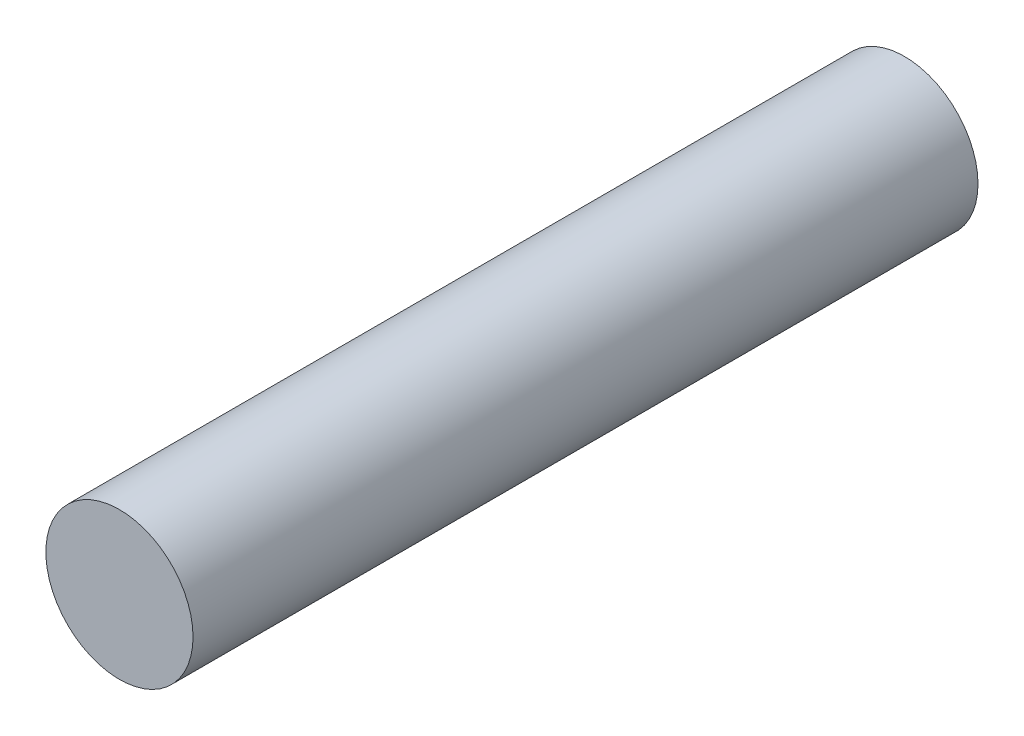
ISO-10303-21;
HEADER;
FILE_DESCRIPTION(('STEP AP214'),'2;1');
FILE_NAME('part.step','',(''),(''),'','','');
FILE_SCHEMA(('AUTOMOTIVE_DESIGN { 1 0 10303 214 1 1 1 1 }'));
ENDSEC;
DATA;
#1=APPLICATION_CONTEXT('core data for automotive mechanical design processes');
#2=APPLICATION_PROTOCOL_DEFINITION('international standard','automotive_design',2000,#1);
#3=PRODUCT_CONTEXT('',#1,'mechanical');
#4=PRODUCT('Part','Part','',(#3));
#5=PRODUCT_RELATED_PRODUCT_CATEGORY('part','',(#4));
#6=PRODUCT_DEFINITION_FORMATION('','',#4);
#7=PRODUCT_DEFINITION_CONTEXT('part definition',#1,'design');
#8=PRODUCT_DEFINITION('design','',#6,#7);
#9=PRODUCT_DEFINITION_SHAPE('','',#8);
#10=(LENGTH_UNIT() NAMED_UNIT(*) SI_UNIT(.MILLI.,.METRE.));
#11=(NAMED_UNIT(*) PLANE_ANGLE_UNIT() SI_UNIT($,.RADIAN.));
#12=(NAMED_UNIT(*) SI_UNIT($,.STERADIAN.) SOLID_ANGLE_UNIT());
#13=UNCERTAINTY_MEASURE_WITH_UNIT(LENGTH_MEASURE(1.E-05),#10,'distance_accuracy_value','');
#14=(GEOMETRIC_REPRESENTATION_CONTEXT(3) GLOBAL_UNCERTAINTY_ASSIGNED_CONTEXT((#13)) GLOBAL_UNIT_ASSIGNED_CONTEXT((#10,
#11,#12)) REPRESENTATION_CONTEXT('',''));
#15=CARTESIAN_POINT('',(0.,0.,0.));
#16=DIRECTION('',(0.,0.,1.));
#17=DIRECTION('',(1.,0.,0.));
#18=AXIS2_PLACEMENT_3D('',#15,#16,#17);
#19=CARTESIAN_POINT('',(0.,0.,80.));
#20=DIRECTION('',(0.,0.,-1.));
#21=DIRECTION('',(-1.,0.,0.));
#22=AXIS2_PLACEMENT_3D('',#19,#20,#21);
#23=CYLINDRICAL_SURFACE('',#22,7.5);
#24=CARTESIAN_POINT('',(0.,0.,80.));
#25=DIRECTION('',(0.,0.,1.));
#26=DIRECTION('',(1.,0.,0.));
#27=AXIS2_PLACEMENT_3D('',#24,#25,#26);
#28=CIRCLE('',#27,7.5);
#29=CARTESIAN_POINT('',(7.5,0.,80.));
#30=VERTEX_POINT('',#29);
#31=EDGE_CURVE('E10',#30,#30,#28,.T.);
#32=ORIENTED_EDGE('',*,*,#31,.F.);
#33=EDGE_LOOP('',(#32));
#34=FACE_BOUND('',#33,.T.);
#35=CARTESIAN_POINT('',(0.,0.,0.));
#36=DIRECTION('',(0.,0.,1.));
#37=DIRECTION('',(1.,0.,0.));
#38=AXIS2_PLACEMENT_3D('',#35,#36,#37);
#39=CIRCLE('',#38,7.5);
#40=CARTESIAN_POINT('',(7.5,0.,0.));
#41=VERTEX_POINT('',#40);
#42=EDGE_CURVE('E40',#41,#41,#39,.T.);
#43=ORIENTED_EDGE('',*,*,#42,.T.);
#44=EDGE_LOOP('',(#43));
#45=FACE_BOUND('',#44,.T.);
#46=ADVANCED_FACE('F37',(#34,#45),#23,.T.);
#47=CARTESIAN_POINT('',(0.,0.,80.));
#48=DIRECTION('',(0.,0.,1.));
#49=DIRECTION('',(1.,0.,0.));
#50=AXIS2_PLACEMENT_3D('',#47,#48,#49);
#51=PLANE('',#50);
#52=ORIENTED_EDGE('',*,*,#31,.T.);
#53=EDGE_LOOP('',(#52));
#54=FACE_BOUND('',#53,.T.);
#55=ADVANCED_FACE('F71',(#54),#51,.T.);
#56=CARTESIAN_POINT('',(0.,0.,0.));
#57=DIRECTION('',(0.,0.,1.));
#58=DIRECTION('',(1.,0.,0.));
#59=AXIS2_PLACEMENT_3D('',#56,#57,#58);
#60=PLANE('',#59);
#61=CARTESIAN_POINT('',(0.,0.,0.));
#62=DIRECTION('',(0.,0.,1.));
#63=DIRECTION('',(1.,0.,0.));
#64=AXIS2_PLACEMENT_3D('',#61,#62,#63);
#65=CIRCLE('',#64,4.);
#66=CARTESIAN_POINT('',(4.,0.,0.));
#67=VERTEX_POINT('',#66);
#68=EDGE_CURVE('E51',#67,#67,#65,.T.);
#69=ORIENTED_EDGE('',*,*,#68,.T.);
#70=EDGE_LOOP('',(#69));
#71=FACE_BOUND('',#70,.T.);
#72=ORIENTED_EDGE('',*,*,#42,.F.);
#73=EDGE_LOOP('',(#72));
#74=FACE_BOUND('',#73,.T.);
#75=ADVANCED_FACE('F68',(#71,#74),#60,.F.);
#76=CARTESIAN_POINT('',(0.,0.,30.));
#77=DIRECTION('',(0.,0.,-1.));
#78=DIRECTION('',(-1.,0.,0.));
#79=AXIS2_PLACEMENT_3D('',#76,#77,#78);
#80=CYLINDRICAL_SURFACE('',#79,4.);
#81=CARTESIAN_POINT('',(0.,0.,30.));
#82=DIRECTION('',(0.,0.,1.));
#83=DIRECTION('',(1.,0.,0.));
#84=AXIS2_PLACEMENT_3D('',#81,#82,#83);
#85=CIRCLE('',#84,4.);
#86=CARTESIAN_POINT('',(4.,0.,30.));
#87=VERTEX_POINT('',#86);
#88=EDGE_CURVE('E49',#87,#87,#85,.T.);
#89=ORIENTED_EDGE('',*,*,#88,.T.);
#90=EDGE_LOOP('',(#89));
#91=FACE_BOUND('',#90,.T.);
#92=ORIENTED_EDGE('',*,*,#68,.F.);
#93=EDGE_LOOP('',(#92));
#94=FACE_BOUND('',#93,.T.);
#95=ADVANCED_FACE('F59',(#91,#94),#80,.F.);
#96=CARTESIAN_POINT('',(0.,0.,30.));
#97=DIRECTION('',(0.,0.,1.));
#98=DIRECTION('',(1.,0.,0.));
#99=AXIS2_PLACEMENT_3D('',#96,#97,#98);
#100=PLANE('',#99);
#101=ORIENTED_EDGE('',*,*,#88,.F.);
#102=EDGE_LOOP('',(#101));
#103=FACE_BOUND('',#102,.T.);
#104=ADVANCED_FACE('F62',(#103),#100,.F.);
#105=CLOSED_SHELL('',(#46,#55,#75,#95,#104));
#106=MANIFOLD_SOLID_BREP('B2',#105);
#107=ADVANCED_BREP_SHAPE_REPRESENTATION('',(#18,#106),#14);
#108=SHAPE_DEFINITION_REPRESENTATION(#9,#107);
ENDSEC;
END-ISO-10303-21;
